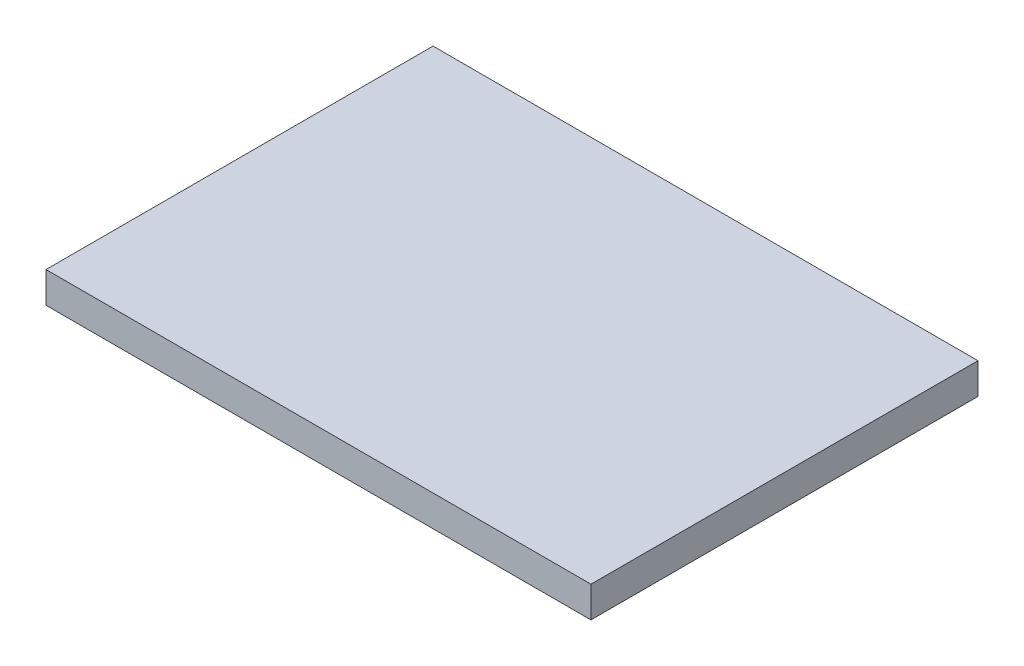
ISO-10303-21;
HEADER;
FILE_DESCRIPTION(('STEP AP214'),'2;1');
FILE_NAME('part.step','',(''),(''),'','','');
FILE_SCHEMA(('AUTOMOTIVE_DESIGN { 1 0 10303 214 1 1 1 1 }'));
ENDSEC;
DATA;
#1=APPLICATION_CONTEXT('core data for automotive mechanical design processes');
#2=APPLICATION_PROTOCOL_DEFINITION('international standard','automotive_design',2000,#1);
#3=PRODUCT_CONTEXT('',#1,'mechanical');
#4=PRODUCT('Part','Part','',(#3));
#5=PRODUCT_RELATED_PRODUCT_CATEGORY('part','',(#4));
#6=PRODUCT_DEFINITION_FORMATION('','',#4);
#7=PRODUCT_DEFINITION_CONTEXT('part definition',#1,'design');
#8=PRODUCT_DEFINITION('design','',#6,#7);
#9=PRODUCT_DEFINITION_SHAPE('','',#8);
#10=(LENGTH_UNIT() NAMED_UNIT(*) SI_UNIT(.MILLI.,.METRE.));
#11=(NAMED_UNIT(*) PLANE_ANGLE_UNIT() SI_UNIT($,.RADIAN.));
#12=(NAMED_UNIT(*) SI_UNIT($,.STERADIAN.) SOLID_ANGLE_UNIT());
#13=UNCERTAINTY_MEASURE_WITH_UNIT(LENGTH_MEASURE(1.E-05),#10,'distance_accuracy_value','');
#14=(GEOMETRIC_REPRESENTATION_CONTEXT(3) GLOBAL_UNCERTAINTY_ASSIGNED_CONTEXT((#13)) GLOBAL_UNIT_ASSIGNED_CONTEXT((#10,
#11,#12)) REPRESENTATION_CONTEXT('',''));
#15=CARTESIAN_POINT('',(0.,0.,0.));
#16=DIRECTION('',(0.,0.,1.));
#17=DIRECTION('',(1.,0.,0.));
#18=AXIS2_PLACEMENT_3D('',#15,#16,#17);
#19=CARTESIAN_POINT('',(17.6,2.,12.5));
#20=DIRECTION('',(-1.,0.,0.));
#21=DIRECTION('',(0.,0.,1.));
#22=AXIS2_PLACEMENT_3D('',#19,#20,#21);
#23=PLANE('',#22);
#24=DIRECTION('',(0.,0.,-1.));
#25=VECTOR('',#24,1.);
#26=CARTESIAN_POINT('',(17.6,0.,12.5));
#27=LINE('',#26,#25);
#28=CARTESIAN_POINT('',(17.6,0.,12.5));
#29=VERTEX_POINT('',#28);
#30=CARTESIAN_POINT('',(17.6,0.,-12.5));
#31=VERTEX_POINT('',#30);
#32=EDGE_CURVE('E107',#29,#31,#27,.T.);
#33=ORIENTED_EDGE('',*,*,#32,.T.);
#34=DIRECTION('',(0.,-1.,0.));
#35=VECTOR('',#34,1.);
#36=CARTESIAN_POINT('',(17.6,2.,-12.5));
#37=LINE('',#36,#35);
#38=CARTESIAN_POINT('',(17.6,2.,-12.5));
#39=VERTEX_POINT('',#38);
#40=EDGE_CURVE('E11',#39,#31,#37,.T.);
#41=ORIENTED_EDGE('',*,*,#40,.F.);
#42=DIRECTION('',(0.,0.,-1.));
#43=VECTOR('',#42,1.);
#44=CARTESIAN_POINT('',(17.6,2.,12.5));
#45=LINE('',#44,#43);
#46=CARTESIAN_POINT('',(17.6,2.,12.5));
#47=VERTEX_POINT('',#46);
#48=EDGE_CURVE('E91',#47,#39,#45,.T.);
#49=ORIENTED_EDGE('',*,*,#48,.F.);
#50=DIRECTION('',(0.,-1.,0.));
#51=VECTOR('',#50,1.);
#52=CARTESIAN_POINT('',(17.6,2.,12.5));
#53=LINE('',#52,#51);
#54=EDGE_CURVE('E103',#47,#29,#53,.T.);
#55=ORIENTED_EDGE('',*,*,#54,.T.);
#56=EDGE_LOOP('',(#33,#41,#49,#55));
#57=FACE_BOUND('',#56,.T.);
#58=ADVANCED_FACE('F39',(#57),#23,.F.);
#59=CARTESIAN_POINT('',(-17.6,2.,-12.5));
#60=DIRECTION('',(0.,0.,1.));
#61=DIRECTION('',(1.,0.,0.));
#62=AXIS2_PLACEMENT_3D('',#59,#60,#61);
#63=PLANE('',#62);
#64=DIRECTION('',(-1.,0.,0.));
#65=VECTOR('',#64,1.);
#66=CARTESIAN_POINT('',(-17.6,0.,-12.5));
#67=LINE('',#66,#65);
#68=CARTESIAN_POINT('',(-17.6,0.,-12.5));
#69=VERTEX_POINT('',#68);
#70=EDGE_CURVE('E96',#31,#69,#67,.T.);
#71=ORIENTED_EDGE('',*,*,#70,.T.);
#72=DIRECTION('',(0.,-1.,0.));
#73=VECTOR('',#72,1.);
#74=CARTESIAN_POINT('',(-17.6,2.,-12.5));
#75=LINE('',#74,#73);
#76=CARTESIAN_POINT('',(-17.6,2.,-12.5));
#77=VERTEX_POINT('',#76);
#78=EDGE_CURVE('E48',#77,#69,#75,.T.);
#79=ORIENTED_EDGE('',*,*,#78,.F.);
#80=DIRECTION('',(-1.,0.,0.));
#81=VECTOR('',#80,1.);
#82=CARTESIAN_POINT('',(-17.6,2.,-12.5));
#83=LINE('',#82,#81);
#84=EDGE_CURVE('E86',#39,#77,#83,.T.);
#85=ORIENTED_EDGE('',*,*,#84,.F.);
#86=ORIENTED_EDGE('',*,*,#40,.T.);
#87=EDGE_LOOP('',(#71,#79,#85,#86));
#88=FACE_BOUND('',#87,.T.);
#89=ADVANCED_FACE('F95',(#88),#63,.F.);
#90=CARTESIAN_POINT('',(-17.6,2.,12.5));
#91=DIRECTION('',(1.,0.,0.));
#92=DIRECTION('',(0.,0.,-1.));
#93=AXIS2_PLACEMENT_3D('',#90,#91,#92);
#94=PLANE('',#93);
#95=DIRECTION('',(0.,0.,1.));
#96=VECTOR('',#95,1.);
#97=CARTESIAN_POINT('',(-17.6,0.,12.5));
#98=LINE('',#97,#96);
#99=CARTESIAN_POINT('',(-17.6,0.,12.5));
#100=VERTEX_POINT('',#99);
#101=EDGE_CURVE('E73',#69,#100,#98,.T.);
#102=ORIENTED_EDGE('',*,*,#101,.T.);
#103=DIRECTION('',(0.,-1.,0.));
#104=VECTOR('',#103,1.);
#105=CARTESIAN_POINT('',(-17.6,2.,12.5));
#106=LINE('',#105,#104);
#107=CARTESIAN_POINT('',(-17.6,2.,12.5));
#108=VERTEX_POINT('',#107);
#109=EDGE_CURVE('E98',#108,#100,#106,.T.);
#110=ORIENTED_EDGE('',*,*,#109,.F.);
#111=DIRECTION('',(0.,0.,1.));
#112=VECTOR('',#111,1.);
#113=CARTESIAN_POINT('',(-17.6,2.,12.5));
#114=LINE('',#113,#112);
#115=EDGE_CURVE('E89',#77,#108,#114,.T.);
#116=ORIENTED_EDGE('',*,*,#115,.F.);
#117=ORIENTED_EDGE('',*,*,#78,.T.);
#118=EDGE_LOOP('',(#102,#110,#116,#117));
#119=FACE_BOUND('',#118,.T.);
#120=ADVANCED_FACE('F99',(#119),#94,.F.);
#121=CARTESIAN_POINT('',(-17.6,2.,12.5));
#122=DIRECTION('',(0.,0.,-1.));
#123=DIRECTION('',(-1.,0.,0.));
#124=AXIS2_PLACEMENT_3D('',#121,#122,#123);
#125=PLANE('',#124);
#126=DIRECTION('',(1.,0.,0.));
#127=VECTOR('',#126,1.);
#128=CARTESIAN_POINT('',(-17.6,0.,12.5));
#129=LINE('',#128,#127);
#130=EDGE_CURVE('E79',#100,#29,#129,.T.);
#131=ORIENTED_EDGE('',*,*,#130,.T.);
#132=ORIENTED_EDGE('',*,*,#54,.F.);
#133=DIRECTION('',(1.,0.,0.));
#134=VECTOR('',#133,1.);
#135=CARTESIAN_POINT('',(-17.6,2.,12.5));
#136=LINE('',#135,#134);
#137=EDGE_CURVE('E56',#108,#47,#136,.T.);
#138=ORIENTED_EDGE('',*,*,#137,.F.);
#139=ORIENTED_EDGE('',*,*,#109,.T.);
#140=EDGE_LOOP('',(#131,#132,#138,#139));
#141=FACE_BOUND('',#140,.T.);
#142=ADVANCED_FACE('F120',(#141),#125,.F.);
#143=CARTESIAN_POINT('',(0.,2.,0.));
#144=DIRECTION('',(0.,-1.,0.));
#145=DIRECTION('',(0.,0.,-1.));
#146=AXIS2_PLACEMENT_3D('',#143,#144,#145);
#147=PLANE('',#146);
#148=ORIENTED_EDGE('',*,*,#48,.T.);
#149=ORIENTED_EDGE('',*,*,#84,.T.);
#150=ORIENTED_EDGE('',*,*,#115,.T.);
#151=ORIENTED_EDGE('',*,*,#137,.T.);
#152=EDGE_LOOP('',(#148,#149,#150,#151));
#153=FACE_BOUND('',#152,.T.);
#154=ADVANCED_FACE('F87',(#153),#147,.F.);
#155=CARTESIAN_POINT('',(0.,0.,0.));
#156=DIRECTION('',(0.,-1.,0.));
#157=DIRECTION('',(0.,0.,-1.));
#158=AXIS2_PLACEMENT_3D('',#155,#156,#157);
#159=PLANE('',#158);
#160=ORIENTED_EDGE('',*,*,#32,.F.);
#161=ORIENTED_EDGE('',*,*,#130,.F.);
#162=ORIENTED_EDGE('',*,*,#101,.F.);
#163=ORIENTED_EDGE('',*,*,#70,.F.);
#164=EDGE_LOOP('',(#160,#161,#162,#163));
#165=FACE_BOUND('',#164,.T.);
#166=ADVANCED_FACE('F123',(#165),#159,.T.);
#167=CLOSED_SHELL('',(#58,#89,#120,#142,#154,#166));
#168=MANIFOLD_SOLID_BREP('B2',#167);
#169=ADVANCED_BREP_SHAPE_REPRESENTATION('',(#18,#168),#14);
#170=SHAPE_DEFINITION_REPRESENTATION(#9,#169);
ENDSEC;
END-ISO-10303-21;
